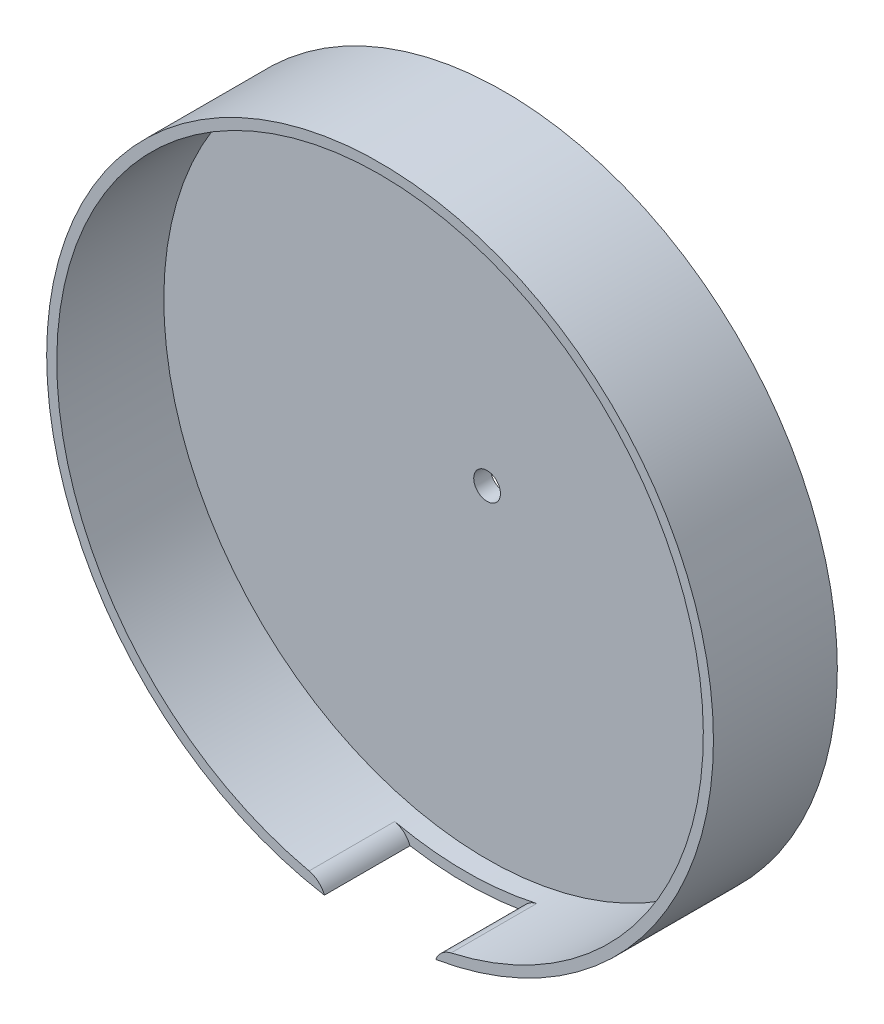
ISO-10303-21;
HEADER;
FILE_DESCRIPTION(('STEP AP214'),'2;1');
FILE_NAME('part.step','',(''),(''),'','','');
FILE_SCHEMA(('AUTOMOTIVE_DESIGN { 1 0 10303 214 1 1 1 1 }'));
ENDSEC;
DATA;
#1=APPLICATION_CONTEXT('core data for automotive mechanical design processes');
#2=APPLICATION_PROTOCOL_DEFINITION('international standard','automotive_design',2000,#1);
#3=PRODUCT_CONTEXT('',#1,'mechanical');
#4=PRODUCT('Part','Part','',(#3));
#5=PRODUCT_RELATED_PRODUCT_CATEGORY('part','',(#4));
#6=PRODUCT_DEFINITION_FORMATION('','',#4);
#7=PRODUCT_DEFINITION_CONTEXT('part definition',#1,'design');
#8=PRODUCT_DEFINITION('design','',#6,#7);
#9=PRODUCT_DEFINITION_SHAPE('','',#8);
#10=(LENGTH_UNIT() NAMED_UNIT(*) SI_UNIT(.MILLI.,.METRE.));
#11=(NAMED_UNIT(*) PLANE_ANGLE_UNIT() SI_UNIT($,.RADIAN.));
#12=(NAMED_UNIT(*) SI_UNIT($,.STERADIAN.) SOLID_ANGLE_UNIT());
#13=UNCERTAINTY_MEASURE_WITH_UNIT(LENGTH_MEASURE(1.E-05),#10,'distance_accuracy_value','');
#14=(GEOMETRIC_REPRESENTATION_CONTEXT(3) GLOBAL_UNCERTAINTY_ASSIGNED_CONTEXT((#13)) GLOBAL_UNIT_ASSIGNED_CONTEXT((#10,
#11,#12)) REPRESENTATION_CONTEXT('',''));
#15=CARTESIAN_POINT('',(0.,0.,0.));
#16=DIRECTION('',(0.,0.,1.));
#17=DIRECTION('',(1.,0.,0.));
#18=AXIS2_PLACEMENT_3D('',#15,#16,#17);
#19=CARTESIAN_POINT('',(0.,0.,12.7));
#20=DIRECTION('',(0.,0.,1.));
#21=DIRECTION('',(1.,0.,0.));
#22=AXIS2_PLACEMENT_3D('',#19,#20,#21);
#23=PLANE('',#22);
#24=CARTESIAN_POINT('',(0.,0.,12.7));
#25=DIRECTION('',(0.,0.,1.));
#26=DIRECTION('',(1.,0.,0.));
#27=AXIS2_PLACEMENT_3D('',#24,#25,#26);
#28=CIRCLE('',#27,39.554);
#29=CARTESIAN_POINT('',(6.604,-38.9987961352655,12.7));
#30=VERTEX_POINT('',#29);
#31=CARTESIAN_POINT('',(-6.604,-38.9987961352655,12.7));
#32=VERTEX_POINT('',#31);
#33=EDGE_CURVE('E113',#30,#32,#28,.T.);
#34=ORIENTED_EDGE('',*,*,#33,.T.);
#35=CARTESIAN_POINT('',(-8.98034922515765,-39.8957712520288,12.7));
#36=DIRECTION('',(0.,0.,1.));
#37=DIRECTION('',(1.,0.,0.));
#38=AXIS2_PLACEMENT_3D('',#35,#36,#37);
#39=CIRCLE('',#38,2.54);
#40=CARTESIAN_POINT('',(-8.42256355899879,-37.4177730376171,12.7));
#41=VERTEX_POINT('',#40);
#42=EDGE_CURVE('E97',#32,#41,#39,.T.);
#43=ORIENTED_EDGE('',*,*,#42,.T.);
#44=CARTESIAN_POINT('',(0.,0.,12.7));
#45=DIRECTION('',(0.,0.,1.));
#46=DIRECTION('',(1.,0.,0.));
#47=AXIS2_PLACEMENT_3D('',#44,#45,#46);
#48=CIRCLE('',#47,38.354);
#49=CARTESIAN_POINT('',(8.42256355899879,-37.4177730376171,12.7));
#50=VERTEX_POINT('',#49);
#51=EDGE_CURVE('E110',#50,#41,#48,.T.);
#52=ORIENTED_EDGE('',*,*,#51,.F.);
#53=CARTESIAN_POINT('',(8.98034922515765,-39.8957712520288,12.7));
#54=DIRECTION('',(0.,0.,1.));
#55=DIRECTION('',(1.,0.,0.));
#56=AXIS2_PLACEMENT_3D('',#53,#54,#55);
#57=CIRCLE('',#56,2.54);
#58=EDGE_CURVE('E118',#50,#30,#57,.T.);
#59=ORIENTED_EDGE('',*,*,#58,.T.);
#60=EDGE_LOOP('',(#34,#43,#52,#59));
#61=FACE_BOUND('',#60,.T.);
#62=ADVANCED_FACE('F41',(#61),#23,.T.);
#63=CARTESIAN_POINT('',(0.,0.,12.7));
#64=DIRECTION('',(0.,0.,-1.));
#65=DIRECTION('',(-1.,0.,0.));
#66=AXIS2_PLACEMENT_3D('',#63,#64,#65);
#67=CYLINDRICAL_SURFACE('',#66,39.554);
#68=CARTESIAN_POINT('',(0.,0.,-2.));
#69=DIRECTION('',(0.,0.,1.));
#70=DIRECTION('',(1.,0.,0.));
#71=AXIS2_PLACEMENT_3D('',#68,#69,#70);
#72=CIRCLE('',#71,39.554);
#73=CARTESIAN_POINT('',(39.554,0.,-2.));
#74=VERTEX_POINT('',#73);
#75=EDGE_CURVE('E106',#74,#74,#72,.T.);
#76=ORIENTED_EDGE('',*,*,#75,.T.);
#77=EDGE_LOOP('',(#76));
#78=FACE_BOUND('',#77,.T.);
#79=DIRECTION('',(0.,0.,-1.));
#80=VECTOR('',#79,1.);
#81=CARTESIAN_POINT('',(6.604,-38.9987961352655,12.7));
#82=LINE('',#81,#80);
#83=CARTESIAN_POINT('',(6.604,-38.9987961352655,2.54));
#84=VERTEX_POINT('',#83);
#85=EDGE_CURVE('E92',#30,#84,#82,.T.);
#86=ORIENTED_EDGE('',*,*,#85,.T.);
#87=CARTESIAN_POINT('',(0.,0.,2.54));
#88=DIRECTION('',(0.,0.,-1.));
#89=DIRECTION('',(-1.,0.,0.));
#90=AXIS2_PLACEMENT_3D('',#87,#88,#89);
#91=CIRCLE('',#90,39.554);
#92=CARTESIAN_POINT('',(-6.604,-38.9987961352655,2.54));
#93=VERTEX_POINT('',#92);
#94=EDGE_CURVE('E79',#93,#84,#91,.F.);
#95=ORIENTED_EDGE('',*,*,#94,.F.);
#96=DIRECTION('',(0.,0.,-1.));
#97=VECTOR('',#96,1.);
#98=CARTESIAN_POINT('',(-6.604,-38.9987961352655,12.7));
#99=LINE('',#98,#97);
#100=EDGE_CURVE('E89',#32,#93,#99,.T.);
#101=ORIENTED_EDGE('',*,*,#100,.F.);
#102=ORIENTED_EDGE('',*,*,#33,.F.);
#103=EDGE_LOOP('',(#86,#95,#101,#102));
#104=FACE_BOUND('',#103,.T.);
#105=ADVANCED_FACE('F87',(#78,#104),#67,.T.);
#106=CARTESIAN_POINT('',(0.,0.,12.7));
#107=DIRECTION('',(0.,0.,-1.));
#108=DIRECTION('',(-1.,0.,0.));
#109=AXIS2_PLACEMENT_3D('',#106,#107,#108);
#110=CYLINDRICAL_SURFACE('',#109,38.354);
#111=CARTESIAN_POINT('',(0.,0.,0.));
#112=DIRECTION('',(0.,0.,1.));
#113=DIRECTION('',(1.,0.,0.));
#114=AXIS2_PLACEMENT_3D('',#111,#112,#113);
#115=CIRCLE('',#114,38.354);
#116=CARTESIAN_POINT('',(38.354,0.,0.));
#117=VERTEX_POINT('',#116);
#118=EDGE_CURVE('E109',#117,#117,#115,.T.);
#119=ORIENTED_EDGE('',*,*,#118,.F.);
#120=EDGE_LOOP('',(#119));
#121=FACE_BOUND('',#120,.T.);
#122=ORIENTED_EDGE('',*,*,#51,.T.);
#123=DIRECTION('',(0.,0.,-1.));
#124=VECTOR('',#123,1.);
#125=CARTESIAN_POINT('',(-8.42256355899879,-37.4177730376171,12.7));
#126=LINE('',#125,#124);
#127=CARTESIAN_POINT('',(-8.42256355899879,-37.4177730376171,2.54));
#128=VERTEX_POINT('',#127);
#129=EDGE_CURVE('E84',#41,#128,#126,.T.);
#130=ORIENTED_EDGE('',*,*,#129,.T.);
#131=CARTESIAN_POINT('',(0.,0.,2.54));
#132=DIRECTION('',(0.,0.,-1.));
#133=DIRECTION('',(-1.,0.,0.));
#134=AXIS2_PLACEMENT_3D('',#131,#132,#133);
#135=CIRCLE('',#134,38.354);
#136=CARTESIAN_POINT('',(8.42256355899879,-37.4177730376171,2.54));
#137=VERTEX_POINT('',#136);
#138=EDGE_CURVE('E55',#137,#128,#135,.T.);
#139=ORIENTED_EDGE('',*,*,#138,.F.);
#140=DIRECTION('',(0.,0.,-1.));
#141=VECTOR('',#140,1.);
#142=CARTESIAN_POINT('',(8.42256355899879,-37.4177730376171,12.7));
#143=LINE('',#142,#141);
#144=EDGE_CURVE('E121',#137,#50,#143,.F.);
#145=ORIENTED_EDGE('',*,*,#144,.T.);
#146=EDGE_LOOP('',(#122,#130,#139,#145));
#147=FACE_BOUND('',#146,.T.);
#148=ADVANCED_FACE('F123',(#121,#147),#110,.F.);
#149=CARTESIAN_POINT('',(0.,0.,0.));
#150=DIRECTION('',(0.,0.,1.));
#151=DIRECTION('',(1.,0.,0.));
#152=AXIS2_PLACEMENT_3D('',#149,#150,#151);
#153=PLANE('',#152);
#154=CARTESIAN_POINT('',(0.,0.,0.));
#155=DIRECTION('',(0.,0.,1.));
#156=DIRECTION('',(1.,0.,0.));
#157=AXIS2_PLACEMENT_3D('',#154,#155,#156);
#158=CIRCLE('',#157,1.5875);
#159=CARTESIAN_POINT('',(1.5875,0.,0.));
#160=VERTEX_POINT('',#159);
#161=EDGE_CURVE('E103',#160,#160,#158,.T.);
#162=ORIENTED_EDGE('',*,*,#161,.F.);
#163=EDGE_LOOP('',(#162));
#164=FACE_BOUND('',#163,.T.);
#165=ORIENTED_EDGE('',*,*,#118,.T.);
#166=EDGE_LOOP('',(#165));
#167=FACE_BOUND('',#166,.T.);
#168=ADVANCED_FACE('F142',(#164,#167),#153,.T.);
#169=CARTESIAN_POINT('',(0.,0.,-2.));
#170=DIRECTION('',(0.,0.,1.));
#171=DIRECTION('',(1.,0.,0.));
#172=AXIS2_PLACEMENT_3D('',#169,#170,#171);
#173=PLANE('',#172);
#174=CARTESIAN_POINT('',(0.,0.,-2.));
#175=DIRECTION('',(0.,0.,-1.));
#176=DIRECTION('',(-1.,0.,0.));
#177=AXIS2_PLACEMENT_3D('',#174,#175,#176);
#178=CIRCLE('',#177,1.5875);
#179=CARTESIAN_POINT('',(-1.5875,0.,-2.));
#180=VERTEX_POINT('',#179);
#181=EDGE_CURVE('E94',#180,#180,#178,.T.);
#182=ORIENTED_EDGE('',*,*,#181,.F.);
#183=EDGE_LOOP('',(#182));
#184=FACE_BOUND('',#183,.T.);
#185=ORIENTED_EDGE('',*,*,#75,.F.);
#186=EDGE_LOOP('',(#185));
#187=FACE_BOUND('',#186,.T.);
#188=ADVANCED_FACE('F146',(#184,#187),#173,.F.);
#189=CARTESIAN_POINT('',(0.,0.,12.7));
#190=DIRECTION('',(0.,0.,-1.));
#191=DIRECTION('',(-1.,0.,0.));
#192=AXIS2_PLACEMENT_3D('',#189,#190,#191);
#193=CYLINDRICAL_SURFACE('',#192,1.5875);
#194=ORIENTED_EDGE('',*,*,#161,.T.);
#195=EDGE_LOOP('',(#194));
#196=FACE_BOUND('',#195,.T.);
#197=ORIENTED_EDGE('',*,*,#181,.T.);
#198=EDGE_LOOP('',(#197));
#199=FACE_BOUND('',#198,.T.);
#200=ADVANCED_FACE('F150',(#196,#199),#193,.F.);
#201=CARTESIAN_POINT('',(0.,-39.555,2.54));
#202=DIRECTION('',(0.,0.,-1.));
#203=DIRECTION('',(-1.,0.,0.));
#204=AXIS2_PLACEMENT_3D('',#201,#202,#203);
#205=PLANE('',#204);
#206=ORIENTED_EDGE('',*,*,#138,.T.);
#207=CARTESIAN_POINT('',(-8.98034922515765,-39.8957712520288,2.54));
#208=DIRECTION('',(0.,0.,-1.));
#209=DIRECTION('',(-1.,0.,0.));
#210=AXIS2_PLACEMENT_3D('',#207,#208,#209);
#211=CIRCLE('',#210,2.54);
#212=EDGE_CURVE('E49',#128,#93,#211,.T.);
#213=ORIENTED_EDGE('',*,*,#212,.T.);
#214=ORIENTED_EDGE('',*,*,#94,.T.);
#215=CARTESIAN_POINT('',(8.98034922515765,-39.8957712520288,2.54));
#216=DIRECTION('',(0.,0.,-1.));
#217=DIRECTION('',(-1.,0.,0.));
#218=AXIS2_PLACEMENT_3D('',#215,#216,#217);
#219=CIRCLE('',#218,2.54);
#220=EDGE_CURVE('E12',#84,#137,#219,.T.);
#221=ORIENTED_EDGE('',*,*,#220,.T.);
#222=EDGE_LOOP('',(#206,#213,#214,#221));
#223=FACE_BOUND('',#222,.T.);
#224=ADVANCED_FACE('F78',(#223),#205,.F.);
#225=CARTESIAN_POINT('',(-8.98034922515765,-39.8957712520288,12.7));
#226=DIRECTION('',(0.,0.,1.));
#227=DIRECTION('',(1.,0.,0.));
#228=AXIS2_PLACEMENT_3D('',#225,#226,#227);
#229=CYLINDRICAL_SURFACE('',#228,2.54);
#230=ORIENTED_EDGE('',*,*,#212,.F.);
#231=ORIENTED_EDGE('',*,*,#129,.F.);
#232=ORIENTED_EDGE('',*,*,#42,.F.);
#233=ORIENTED_EDGE('',*,*,#100,.T.);
#234=EDGE_LOOP('',(#230,#231,#232,#233));
#235=FACE_BOUND('',#234,.T.);
#236=ADVANCED_FACE('F96',(#235),#229,.T.);
#237=CARTESIAN_POINT('',(8.98034922515765,-39.8957712520288,12.7));
#238=DIRECTION('',(0.,0.,1.));
#239=DIRECTION('',(1.,0.,0.));
#240=AXIS2_PLACEMENT_3D('',#237,#238,#239);
#241=CYLINDRICAL_SURFACE('',#240,2.54);
#242=ORIENTED_EDGE('',*,*,#220,.F.);
#243=ORIENTED_EDGE('',*,*,#85,.F.);
#244=ORIENTED_EDGE('',*,*,#58,.F.);
#245=ORIENTED_EDGE('',*,*,#144,.F.);
#246=EDGE_LOOP('',(#242,#243,#244,#245));
#247=FACE_BOUND('',#246,.T.);
#248=ADVANCED_FACE('F43',(#247),#241,.T.);
#249=CLOSED_SHELL('',(#62,#105,#148,#168,#188,#200,#224,#236,#248));
#250=MANIFOLD_SOLID_BREP('B2',#249);
#251=ADVANCED_BREP_SHAPE_REPRESENTATION('',(#18,#250),#14);
#252=SHAPE_DEFINITION_REPRESENTATION(#9,#251);
ENDSEC;
END-ISO-10303-21;
